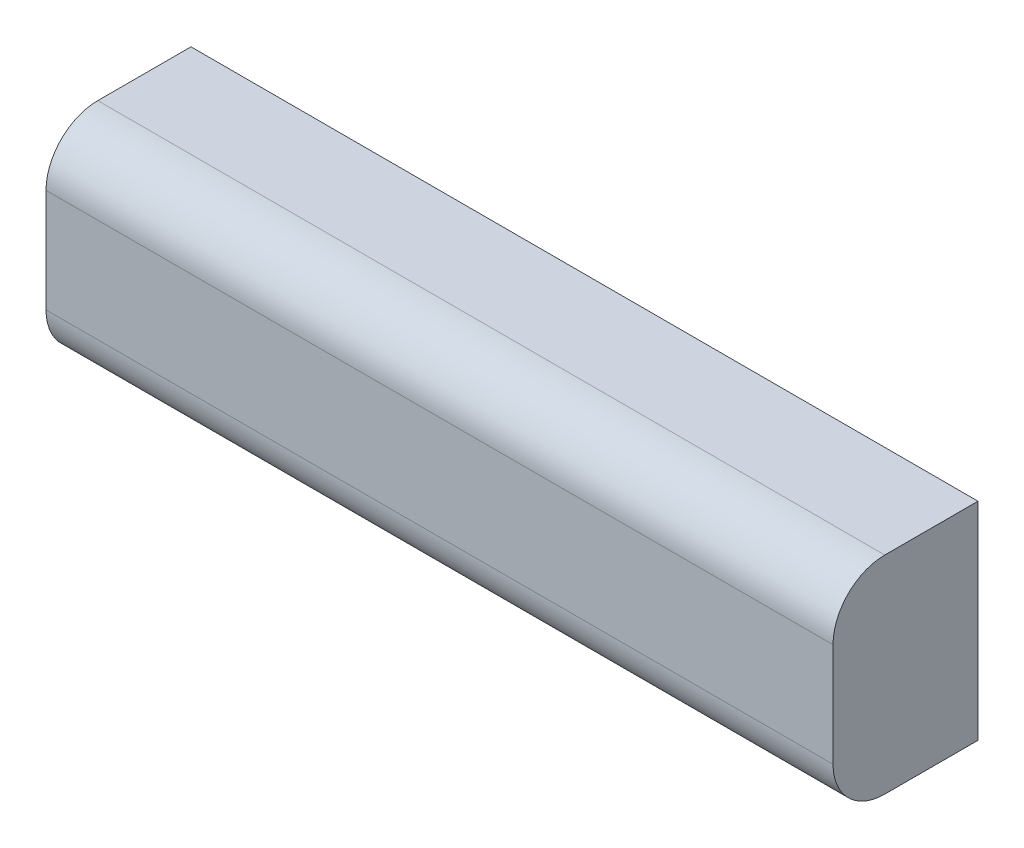
ISO-10303-21;
HEADER;
FILE_DESCRIPTION(('STEP AP214'),'2;1');
FILE_NAME('part.step','',(''),(''),'','','');
FILE_SCHEMA(('AUTOMOTIVE_DESIGN { 1 0 10303 214 1 1 1 1 }'));
ENDSEC;
DATA;
#1=APPLICATION_CONTEXT('core data for automotive mechanical design processes');
#2=APPLICATION_PROTOCOL_DEFINITION('international standard','automotive_design',2000,#1);
#3=PRODUCT_CONTEXT('',#1,'mechanical');
#4=PRODUCT('Part','Part','',(#3));
#5=PRODUCT_RELATED_PRODUCT_CATEGORY('part','',(#4));
#6=PRODUCT_DEFINITION_FORMATION('','',#4);
#7=PRODUCT_DEFINITION_CONTEXT('part definition',#1,'design');
#8=PRODUCT_DEFINITION('design','',#6,#7);
#9=PRODUCT_DEFINITION_SHAPE('','',#8);
#10=(LENGTH_UNIT() NAMED_UNIT(*) SI_UNIT(.MILLI.,.METRE.));
#11=(NAMED_UNIT(*) PLANE_ANGLE_UNIT() SI_UNIT($,.RADIAN.));
#12=(NAMED_UNIT(*) SI_UNIT($,.STERADIAN.) SOLID_ANGLE_UNIT());
#13=UNCERTAINTY_MEASURE_WITH_UNIT(LENGTH_MEASURE(1.E-05),#10,'distance_accuracy_value','');
#14=(GEOMETRIC_REPRESENTATION_CONTEXT(3) GLOBAL_UNCERTAINTY_ASSIGNED_CONTEXT((#13)) GLOBAL_UNIT_ASSIGNED_CONTEXT((#10,
#11,#12)) REPRESENTATION_CONTEXT('',''));
#15=CARTESIAN_POINT('',(0.,0.,0.));
#16=DIRECTION('',(0.,0.,1.));
#17=DIRECTION('',(1.,0.,0.));
#18=AXIS2_PLACEMENT_3D('',#15,#16,#17);
#19=CARTESIAN_POINT('',(482.6,0.,0.));
#20=DIRECTION('',(0.,0.,-1.));
#21=DIRECTION('',(-1.,0.,0.));
#22=AXIS2_PLACEMENT_3D('',#19,#20,#21);
#23=PLANE('',#22);
#24=DIRECTION('',(0.,-1.,0.));
#25=VECTOR('',#24,1.);
#26=CARTESIAN_POINT('',(0.,0.,0.));
#27=LINE('',#26,#25);
#28=CARTESIAN_POINT('',(0.,95.25,0.));
#29=VERTEX_POINT('',#28);
#30=CARTESIAN_POINT('',(0.,31.75,0.));
#31=VERTEX_POINT('',#30);
#32=EDGE_CURVE('E116',#29,#31,#27,.T.);
#33=ORIENTED_EDGE('',*,*,#32,.T.);
#34=DIRECTION('',(-1.,0.,0.));
#35=VECTOR('',#34,1.);
#36=CARTESIAN_POINT('',(482.6,31.75,0.));
#37=LINE('',#36,#35);
#38=CARTESIAN_POINT('',(482.6,31.75,0.));
#39=VERTEX_POINT('',#38);
#40=EDGE_CURVE('E54',#31,#39,#37,.F.);
#41=ORIENTED_EDGE('',*,*,#40,.T.);
#42=DIRECTION('',(0.,-1.,0.));
#43=VECTOR('',#42,1.);
#44=CARTESIAN_POINT('',(482.6,0.,0.));
#45=LINE('',#44,#43);
#46=CARTESIAN_POINT('',(482.6,95.25,0.));
#47=VERTEX_POINT('',#46);
#48=EDGE_CURVE('E97',#47,#39,#45,.T.);
#49=ORIENTED_EDGE('',*,*,#48,.F.);
#50=DIRECTION('',(-1.,0.,0.));
#51=VECTOR('',#50,1.);
#52=CARTESIAN_POINT('',(482.6,95.25,0.));
#53=LINE('',#52,#51);
#54=EDGE_CURVE('E129',#47,#29,#53,.T.);
#55=ORIENTED_EDGE('',*,*,#54,.T.);
#56=EDGE_LOOP('',(#33,#41,#49,#55));
#57=FACE_BOUND('',#56,.T.);
#58=ADVANCED_FACE('F33',(#57),#23,.F.);
#59=CARTESIAN_POINT('',(482.6,0.,0.));
#60=DIRECTION('',(0.,1.,0.));
#61=DIRECTION('',(0.,0.,1.));
#62=AXIS2_PLACEMENT_3D('',#59,#60,#61);
#63=PLANE('',#62);
#64=DIRECTION('',(0.,0.,-1.));
#65=VECTOR('',#64,1.);
#66=CARTESIAN_POINT('',(482.6,0.,0.));
#67=LINE('',#66,#65);
#68=CARTESIAN_POINT('',(482.6,0.,-31.75));
#69=VERTEX_POINT('',#68);
#70=CARTESIAN_POINT('',(482.6,0.,-88.9));
#71=VERTEX_POINT('',#70);
#72=EDGE_CURVE('E87',#69,#71,#67,.T.);
#73=ORIENTED_EDGE('',*,*,#72,.F.);
#74=DIRECTION('',(-1.,0.,0.));
#75=VECTOR('',#74,1.);
#76=CARTESIAN_POINT('',(482.6,0.,-31.75));
#77=LINE('',#76,#75);
#78=CARTESIAN_POINT('',(0.,0.,-31.75));
#79=VERTEX_POINT('',#78);
#80=EDGE_CURVE('E106',#69,#79,#77,.T.);
#81=ORIENTED_EDGE('',*,*,#80,.T.);
#82=DIRECTION('',(0.,0.,-1.));
#83=VECTOR('',#82,1.);
#84=CARTESIAN_POINT('',(0.,0.,0.));
#85=LINE('',#84,#83);
#86=CARTESIAN_POINT('',(0.,0.,-88.9));
#87=VERTEX_POINT('',#86);
#88=EDGE_CURVE('E103',#79,#87,#85,.T.);
#89=ORIENTED_EDGE('',*,*,#88,.T.);
#90=DIRECTION('',(-1.,0.,0.));
#91=VECTOR('',#90,1.);
#92=CARTESIAN_POINT('',(482.6,0.,-88.9));
#93=LINE('',#92,#91);
#94=EDGE_CURVE('E100',#71,#87,#93,.T.);
#95=ORIENTED_EDGE('',*,*,#94,.F.);
#96=EDGE_LOOP('',(#73,#81,#89,#95));
#97=FACE_BOUND('',#96,.T.);
#98=ADVANCED_FACE('F101',(#97),#63,.F.);
#99=CARTESIAN_POINT('',(482.6,0.,-88.9));
#100=DIRECTION('',(0.,0.,1.));
#101=DIRECTION('',(1.,0.,0.));
#102=AXIS2_PLACEMENT_3D('',#99,#100,#101);
#103=PLANE('',#102);
#104=DIRECTION('',(0.,1.,0.));
#105=VECTOR('',#104,1.);
#106=CARTESIAN_POINT('',(0.,0.,-88.9));
#107=LINE('',#106,#105);
#108=CARTESIAN_POINT('',(0.,127.,-88.9));
#109=VERTEX_POINT('',#108);
#110=EDGE_CURVE('E119',#87,#109,#107,.T.);
#111=ORIENTED_EDGE('',*,*,#110,.T.);
#112=DIRECTION('',(-1.,0.,0.));
#113=VECTOR('',#112,1.);
#114=CARTESIAN_POINT('',(482.6,127.,-88.9));
#115=LINE('',#114,#113);
#116=CARTESIAN_POINT('',(482.6,127.,-88.9));
#117=VERTEX_POINT('',#116);
#118=EDGE_CURVE('E107',#117,#109,#115,.T.);
#119=ORIENTED_EDGE('',*,*,#118,.F.);
#120=DIRECTION('',(0.,1.,0.));
#121=VECTOR('',#120,1.);
#122=CARTESIAN_POINT('',(482.6,0.,-88.9));
#123=LINE('',#122,#121);
#124=EDGE_CURVE('E91',#71,#117,#123,.T.);
#125=ORIENTED_EDGE('',*,*,#124,.F.);
#126=ORIENTED_EDGE('',*,*,#94,.T.);
#127=EDGE_LOOP('',(#111,#119,#125,#126));
#128=FACE_BOUND('',#127,.T.);
#129=ADVANCED_FACE('F109',(#128),#103,.F.);
#130=CARTESIAN_POINT('',(482.6,127.,0.));
#131=DIRECTION('',(0.,-1.,0.));
#132=DIRECTION('',(0.,0.,-1.));
#133=AXIS2_PLACEMENT_3D('',#130,#131,#132);
#134=PLANE('',#133);
#135=DIRECTION('',(0.,0.,1.));
#136=VECTOR('',#135,1.);
#137=CARTESIAN_POINT('',(0.,127.,0.));
#138=LINE('',#137,#136);
#139=CARTESIAN_POINT('',(0.,127.,-31.75));
#140=VERTEX_POINT('',#139);
#141=EDGE_CURVE('E121',#109,#140,#138,.T.);
#142=ORIENTED_EDGE('',*,*,#141,.T.);
#143=DIRECTION('',(-1.,0.,0.));
#144=VECTOR('',#143,1.);
#145=CARTESIAN_POINT('',(482.6,127.,-31.75));
#146=LINE('',#145,#144);
#147=CARTESIAN_POINT('',(482.6,127.,-31.75));
#148=VERTEX_POINT('',#147);
#149=EDGE_CURVE('E11',#140,#148,#146,.F.);
#150=ORIENTED_EDGE('',*,*,#149,.T.);
#151=DIRECTION('',(0.,0.,1.));
#152=VECTOR('',#151,1.);
#153=CARTESIAN_POINT('',(482.6,127.,0.));
#154=LINE('',#153,#152);
#155=EDGE_CURVE('E111',#117,#148,#154,.T.);
#156=ORIENTED_EDGE('',*,*,#155,.F.);
#157=ORIENTED_EDGE('',*,*,#118,.T.);
#158=EDGE_LOOP('',(#142,#150,#156,#157));
#159=FACE_BOUND('',#158,.T.);
#160=ADVANCED_FACE('F141',(#159),#134,.F.);
#161=CARTESIAN_POINT('',(482.6,0.,0.));
#162=DIRECTION('',(-1.,0.,0.));
#163=DIRECTION('',(0.,0.,1.));
#164=AXIS2_PLACEMENT_3D('',#161,#162,#163);
#165=PLANE('',#164);
#166=ORIENTED_EDGE('',*,*,#48,.T.);
#167=CARTESIAN_POINT('',(482.6,31.75,-31.75));
#168=DIRECTION('',(-1.,0.,0.));
#169=DIRECTION('',(0.,0.,1.));
#170=AXIS2_PLACEMENT_3D('',#167,#168,#169);
#171=CIRCLE('',#170,31.75);
#172=EDGE_CURVE('E41',#39,#69,#171,.F.);
#173=ORIENTED_EDGE('',*,*,#172,.T.);
#174=ORIENTED_EDGE('',*,*,#72,.T.);
#175=ORIENTED_EDGE('',*,*,#124,.T.);
#176=ORIENTED_EDGE('',*,*,#155,.T.);
#177=CARTESIAN_POINT('',(482.6,95.25,-31.75));
#178=DIRECTION('',(-1.,0.,0.));
#179=DIRECTION('',(0.,0.,1.));
#180=AXIS2_PLACEMENT_3D('',#177,#178,#179);
#181=CIRCLE('',#180,31.75);
#182=EDGE_CURVE('E133',#148,#47,#181,.F.);
#183=ORIENTED_EDGE('',*,*,#182,.T.);
#184=EDGE_LOOP('',(#166,#173,#174,#175,#176,#183));
#185=FACE_BOUND('',#184,.T.);
#186=ADVANCED_FACE('F89',(#185),#165,.F.);
#187=CARTESIAN_POINT('',(0.,0.,0.));
#188=DIRECTION('',(-1.,0.,0.));
#189=DIRECTION('',(0.,0.,1.));
#190=AXIS2_PLACEMENT_3D('',#187,#188,#189);
#191=PLANE('',#190);
#192=ORIENTED_EDGE('',*,*,#88,.F.);
#193=CARTESIAN_POINT('',(0.,31.75,-31.75));
#194=DIRECTION('',(-1.,0.,0.));
#195=DIRECTION('',(0.,0.,1.));
#196=AXIS2_PLACEMENT_3D('',#193,#194,#195);
#197=CIRCLE('',#196,31.75);
#198=EDGE_CURVE('E127',#79,#31,#197,.T.);
#199=ORIENTED_EDGE('',*,*,#198,.T.);
#200=ORIENTED_EDGE('',*,*,#32,.F.);
#201=CARTESIAN_POINT('',(0.,95.25,-31.75));
#202=DIRECTION('',(-1.,0.,0.));
#203=DIRECTION('',(0.,0.,1.));
#204=AXIS2_PLACEMENT_3D('',#201,#202,#203);
#205=CIRCLE('',#204,31.75);
#206=EDGE_CURVE('E125',#29,#140,#205,.T.);
#207=ORIENTED_EDGE('',*,*,#206,.T.);
#208=ORIENTED_EDGE('',*,*,#141,.F.);
#209=ORIENTED_EDGE('',*,*,#110,.F.);
#210=EDGE_LOOP('',(#192,#199,#200,#207,#208,#209));
#211=FACE_BOUND('',#210,.T.);
#212=ADVANCED_FACE('F140',(#211),#191,.T.);
#213=CARTESIAN_POINT('',(482.6,31.75,-31.75));
#214=DIRECTION('',(-1.,0.,0.));
#215=DIRECTION('',(0.,0.,1.));
#216=AXIS2_PLACEMENT_3D('',#213,#214,#215);
#217=CYLINDRICAL_SURFACE('',#216,31.75);
#218=ORIENTED_EDGE('',*,*,#172,.F.);
#219=ORIENTED_EDGE('',*,*,#40,.F.);
#220=ORIENTED_EDGE('',*,*,#198,.F.);
#221=ORIENTED_EDGE('',*,*,#80,.F.);
#222=EDGE_LOOP('',(#218,#219,#220,#221));
#223=FACE_BOUND('',#222,.T.);
#224=ADVANCED_FACE('F157',(#223),#217,.T.);
#225=CARTESIAN_POINT('',(482.6,95.25,-31.75));
#226=DIRECTION('',(-1.,0.,0.));
#227=DIRECTION('',(0.,0.,1.));
#228=AXIS2_PLACEMENT_3D('',#225,#226,#227);
#229=CYLINDRICAL_SURFACE('',#228,31.75);
#230=ORIENTED_EDGE('',*,*,#182,.F.);
#231=ORIENTED_EDGE('',*,*,#149,.F.);
#232=ORIENTED_EDGE('',*,*,#206,.F.);
#233=ORIENTED_EDGE('',*,*,#54,.F.);
#234=EDGE_LOOP('',(#230,#231,#232,#233));
#235=FACE_BOUND('',#234,.T.);
#236=ADVANCED_FACE('F35',(#235),#229,.T.);
#237=CLOSED_SHELL('',(#58,#98,#129,#160,#186,#212,#224,#236));
#238=MANIFOLD_SOLID_BREP('B2',#237);
#239=ADVANCED_BREP_SHAPE_REPRESENTATION('',(#18,#238),#14);
#240=SHAPE_DEFINITION_REPRESENTATION(#9,#239);
ENDSEC;
END-ISO-10303-21;
